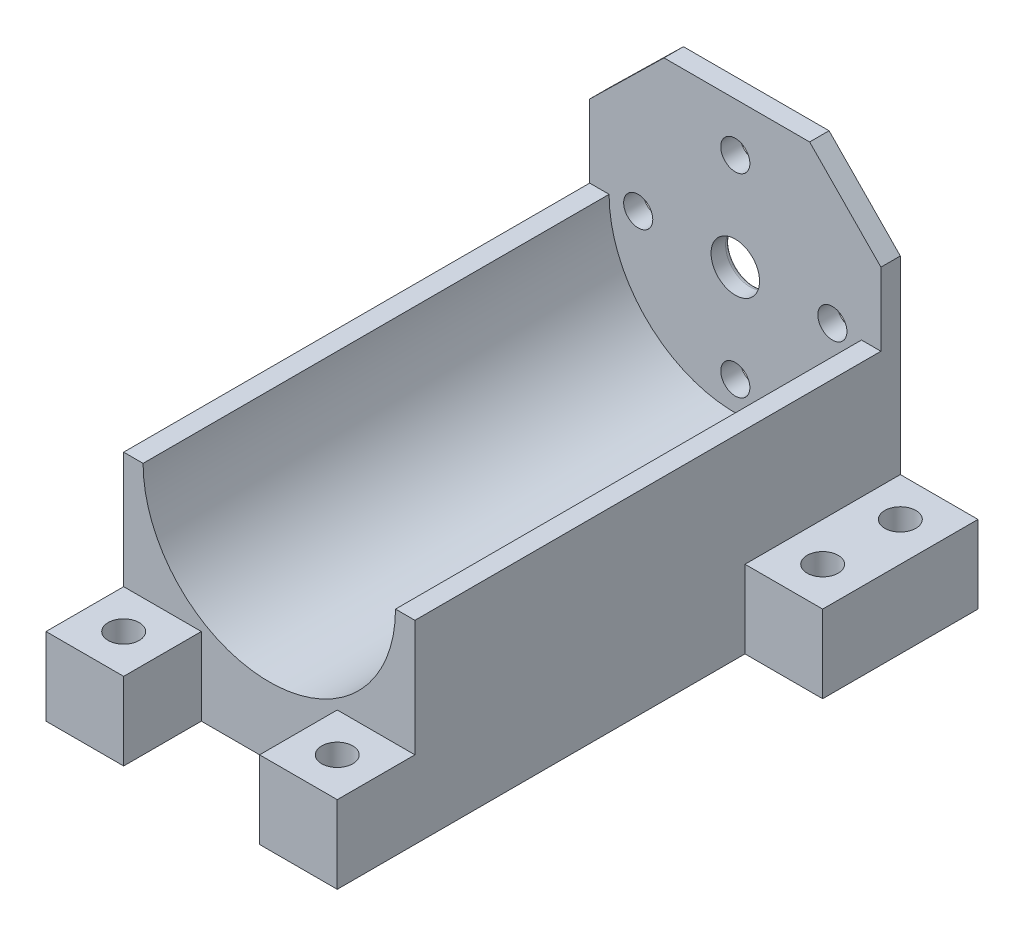
ISO-10303-21;
HEADER;
FILE_DESCRIPTION(('STEP AP214'),'2;1');
FILE_NAME('part.step','',(''),(''),'','','');
FILE_SCHEMA(('AUTOMOTIVE_DESIGN { 1 0 10303 214 1 1 1 1 }'));
ENDSEC;
DATA;
#1=APPLICATION_CONTEXT('core data for automotive mechanical design processes');
#2=APPLICATION_PROTOCOL_DEFINITION('international standard','automotive_design',2000,#1);
#3=PRODUCT_CONTEXT('',#1,'mechanical');
#4=PRODUCT('Part','Part','',(#3));
#5=PRODUCT_RELATED_PRODUCT_CATEGORY('part','',(#4));
#6=PRODUCT_DEFINITION_FORMATION('','',#4);
#7=PRODUCT_DEFINITION_CONTEXT('part definition',#1,'design');
#8=PRODUCT_DEFINITION('design','',#6,#7);
#9=PRODUCT_DEFINITION_SHAPE('','',#8);
#10=(LENGTH_UNIT() NAMED_UNIT(*) SI_UNIT(.MILLI.,.METRE.));
#11=(NAMED_UNIT(*) PLANE_ANGLE_UNIT() SI_UNIT($,.RADIAN.));
#12=(NAMED_UNIT(*) SI_UNIT($,.STERADIAN.) SOLID_ANGLE_UNIT());
#13=UNCERTAINTY_MEASURE_WITH_UNIT(LENGTH_MEASURE(1.E-05),#10,'distance_accuracy_value','');
#14=(GEOMETRIC_REPRESENTATION_CONTEXT(3) GLOBAL_UNCERTAINTY_ASSIGNED_CONTEXT((#13)) GLOBAL_UNIT_ASSIGNED_CONTEXT((#10,
#11,#12)) REPRESENTATION_CONTEXT('',''));
#15=CARTESIAN_POINT('',(0.,0.,0.));
#16=DIRECTION('',(0.,0.,1.));
#17=DIRECTION('',(1.,0.,0.));
#18=AXIS2_PLACEMENT_3D('',#15,#16,#17);
#19=CARTESIAN_POINT('',(0.,0.,50.));
#20=DIRECTION('',(0.,0.,-1.));
#21=DIRECTION('',(-1.,0.,0.));
#22=AXIS2_PLACEMENT_3D('',#19,#20,#21);
#23=PLANE('',#22);
#24=DIRECTION('',(0.,-1.,0.));
#25=VECTOR('',#24,1.);
#26=CARTESIAN_POINT('',(-7.,-12.,50.));
#27=LINE('',#26,#25);
#28=CARTESIAN_POINT('',(-7.,-12.,50.));
#29=VERTEX_POINT('',#28);
#30=CARTESIAN_POINT('',(-7.,-20.,50.));
#31=VERTEX_POINT('',#30);
#32=EDGE_CURVE('E192',#29,#31,#27,.T.);
#33=ORIENTED_EDGE('',*,*,#32,.T.);
#34=DIRECTION('',(-1.,0.,0.));
#35=VECTOR('',#34,1.);
#36=CARTESIAN_POINT('',(0.,-20.,50.));
#37=LINE('',#36,#35);
#38=CARTESIAN_POINT('',(7.,-20.,50.));
#39=VERTEX_POINT('',#38);
#40=EDGE_CURVE('E60',#39,#31,#37,.T.);
#41=ORIENTED_EDGE('',*,*,#40,.F.);
#42=DIRECTION('',(0.,-1.,0.));
#43=VECTOR('',#42,1.);
#44=CARTESIAN_POINT('',(7.,-12.,50.));
#45=LINE('',#44,#43);
#46=CARTESIAN_POINT('',(7.,-12.,50.));
#47=VERTEX_POINT('',#46);
#48=EDGE_CURVE('E236',#47,#39,#45,.T.);
#49=ORIENTED_EDGE('',*,*,#48,.F.);
#50=DIRECTION('',(-1.,0.,0.));
#51=VECTOR('',#50,1.);
#52=CARTESIAN_POINT('',(0.,-12.,50.));
#53=LINE('',#52,#51);
#54=CARTESIAN_POINT('',(15.,-12.,50.));
#55=VERTEX_POINT('',#54);
#56=EDGE_CURVE('E54',#55,#47,#53,.T.);
#57=ORIENTED_EDGE('',*,*,#56,.F.);
#58=DIRECTION('',(0.,1.,0.));
#59=VECTOR('',#58,1.);
#60=CARTESIAN_POINT('',(15.,0.,50.));
#61=LINE('',#60,#59);
#62=CARTESIAN_POINT('',(15.,0.,50.));
#63=VERTEX_POINT('',#62);
#64=EDGE_CURVE('E282',#55,#63,#61,.T.);
#65=ORIENTED_EDGE('',*,*,#64,.T.);
#66=DIRECTION('',(-1.,0.,0.));
#67=VECTOR('',#66,1.);
#68=CARTESIAN_POINT('',(0.,0.,50.));
#69=LINE('',#68,#67);
#70=CARTESIAN_POINT('',(13.,0.,50.));
#71=VERTEX_POINT('',#70);
#72=EDGE_CURVE('E280',#63,#71,#69,.T.);
#73=ORIENTED_EDGE('',*,*,#72,.T.);
#74=CARTESIAN_POINT('',(0.,0.,50.));
#75=DIRECTION('',(0.,0.,-1.));
#76=DIRECTION('',(-1.,0.,0.));
#77=AXIS2_PLACEMENT_3D('',#74,#75,#76);
#78=CIRCLE('',#77,13.);
#79=CARTESIAN_POINT('',(-13.,0.,50.));
#80=VERTEX_POINT('',#79);
#81=EDGE_CURVE('E277',#71,#80,#78,.T.);
#82=ORIENTED_EDGE('',*,*,#81,.T.);
#83=DIRECTION('',(-1.,0.,0.));
#84=VECTOR('',#83,1.);
#85=CARTESIAN_POINT('',(0.,0.,50.));
#86=LINE('',#85,#84);
#87=CARTESIAN_POINT('',(-15.,0.,50.));
#88=VERTEX_POINT('',#87);
#89=EDGE_CURVE('E287',#80,#88,#86,.T.);
#90=ORIENTED_EDGE('',*,*,#89,.T.);
#91=DIRECTION('',(0.,1.,0.));
#92=VECTOR('',#91,1.);
#93=CARTESIAN_POINT('',(-15.,0.,50.));
#94=LINE('',#93,#92);
#95=CARTESIAN_POINT('',(-15.,-12.,50.));
#96=VERTEX_POINT('',#95);
#97=EDGE_CURVE('E285',#96,#88,#94,.T.);
#98=ORIENTED_EDGE('',*,*,#97,.F.);
#99=DIRECTION('',(-1.,0.,0.));
#100=VECTOR('',#99,1.);
#101=CARTESIAN_POINT('',(0.,-12.,50.));
#102=LINE('',#101,#100);
#103=EDGE_CURVE('E189',#29,#96,#102,.T.);
#104=ORIENTED_EDGE('',*,*,#103,.F.);
#105=EDGE_LOOP('',(#33,#41,#49,#57,#65,#73,#82,#90,#98,#104));
#106=FACE_BOUND('',#105,.T.);
#107=ADVANCED_FACE('F39',(#106),#23,.F.);
#108=CARTESIAN_POINT('',(15.,0.,2.));
#109=DIRECTION('',(1.,0.,0.));
#110=DIRECTION('',(0.,0.,-1.));
#111=AXIS2_PLACEMENT_3D('',#108,#109,#110);
#112=PLANE('',#111);
#113=DIRECTION('',(0.,-1.,0.));
#114=VECTOR('',#113,1.);
#115=CARTESIAN_POINT('',(15.,-12.,16.));
#116=LINE('',#115,#114);
#117=CARTESIAN_POINT('',(15.,-12.,16.));
#118=VERTEX_POINT('',#117);
#119=CARTESIAN_POINT('',(15.,-20.,16.));
#120=VERTEX_POINT('',#119);
#121=EDGE_CURVE('E273',#118,#120,#116,.T.);
#122=ORIENTED_EDGE('',*,*,#121,.F.);
#123=DIRECTION('',(0.,0.,1.));
#124=VECTOR('',#123,1.);
#125=CARTESIAN_POINT('',(15.,-12.,0.));
#126=LINE('',#125,#124);
#127=CARTESIAN_POINT('',(15.,-12.,0.));
#128=VERTEX_POINT('',#127);
#129=EDGE_CURVE('E249',#128,#118,#126,.T.);
#130=ORIENTED_EDGE('',*,*,#129,.F.);
#131=DIRECTION('',(0.,-1.,0.));
#132=VECTOR('',#131,1.);
#133=CARTESIAN_POINT('',(15.,0.,0.));
#134=LINE('',#133,#132);
#135=CARTESIAN_POINT('',(15.,7.5,0.));
#136=VERTEX_POINT('',#135);
#137=EDGE_CURVE('E360',#136,#128,#134,.T.);
#138=ORIENTED_EDGE('',*,*,#137,.F.);
#139=DIRECTION('',(0.,0.,-1.));
#140=VECTOR('',#139,1.);
#141=CARTESIAN_POINT('',(15.,7.5,2.));
#142=LINE('',#141,#140);
#143=CARTESIAN_POINT('',(15.,7.5,2.));
#144=VERTEX_POINT('',#143);
#145=EDGE_CURVE('E379',#144,#136,#142,.T.);
#146=ORIENTED_EDGE('',*,*,#145,.F.);
#147=DIRECTION('',(0.,-1.,0.));
#148=VECTOR('',#147,1.);
#149=CARTESIAN_POINT('',(15.,0.,2.));
#150=LINE('',#149,#148);
#151=CARTESIAN_POINT('',(15.,0.,2.));
#152=VERTEX_POINT('',#151);
#153=EDGE_CURVE('E330',#144,#152,#150,.T.);
#154=ORIENTED_EDGE('',*,*,#153,.T.);
#155=DIRECTION('',(0.,0.,-1.));
#156=VECTOR('',#155,1.);
#157=CARTESIAN_POINT('',(15.,0.,50.));
#158=LINE('',#157,#156);
#159=EDGE_CURVE('E305',#63,#152,#158,.T.);
#160=ORIENTED_EDGE('',*,*,#159,.F.);
#161=ORIENTED_EDGE('',*,*,#64,.F.);
#162=DIRECTION('',(0.,0.,1.));
#163=VECTOR('',#162,1.);
#164=CARTESIAN_POINT('',(15.,-12.,0.));
#165=LINE('',#164,#163);
#166=CARTESIAN_POINT('',(15.,-12.,58.));
#167=VERTEX_POINT('',#166);
#168=EDGE_CURVE('E221',#55,#167,#165,.T.);
#169=ORIENTED_EDGE('',*,*,#168,.T.);
#170=DIRECTION('',(0.,-1.,0.));
#171=VECTOR('',#170,1.);
#172=CARTESIAN_POINT('',(15.,-12.,58.));
#173=LINE('',#172,#171);
#174=CARTESIAN_POINT('',(15.,-20.,58.));
#175=VERTEX_POINT('',#174);
#176=EDGE_CURVE('E232',#167,#175,#173,.T.);
#177=ORIENTED_EDGE('',*,*,#176,.T.);
#178=DIRECTION('',(0.,0.,-1.));
#179=VECTOR('',#178,1.);
#180=CARTESIAN_POINT('',(15.,-20.,50.));
#181=LINE('',#180,#179);
#182=EDGE_CURVE('E303',#175,#120,#181,.T.);
#183=ORIENTED_EDGE('',*,*,#182,.T.);
#184=EDGE_LOOP('',(#122,#130,#138,#146,#154,#160,#161,#169,#177,#183));
#185=FACE_BOUND('',#184,.T.);
#186=ADVANCED_FACE('F402',(#185),#112,.T.);
#187=CARTESIAN_POINT('',(11.4098237253435,11.1679362653464,2.));
#188=DIRECTION('',(0.714641377388513,0.699491030481627,0.));
#189=DIRECTION('',(-0.699491030481627,0.714641377388513,0.));
#190=AXIS2_PLACEMENT_3D('',#187,#188,#189);
#191=PLANE('',#190);
#192=DIRECTION('',(0.699491030481627,-0.714641377388513,0.));
#193=VECTOR('',#192,1.);
#194=CARTESIAN_POINT('',(11.4098237253435,11.1679362653464,0.));
#195=LINE('',#194,#193);
#196=CARTESIAN_POINT('',(7.65899947217843,15.,0.));
#197=VERTEX_POINT('',#196);
#198=EDGE_CURVE('E363',#197,#136,#195,.T.);
#199=ORIENTED_EDGE('',*,*,#198,.F.);
#200=DIRECTION('',(0.,0.,-1.));
#201=VECTOR('',#200,1.);
#202=CARTESIAN_POINT('',(7.65899947217843,15.,2.));
#203=LINE('',#202,#201);
#204=CARTESIAN_POINT('',(7.65899947217843,15.,2.));
#205=VERTEX_POINT('',#204);
#206=EDGE_CURVE('E377',#205,#197,#203,.T.);
#207=ORIENTED_EDGE('',*,*,#206,.F.);
#208=DIRECTION('',(0.699491030481627,-0.714641377388513,0.));
#209=VECTOR('',#208,1.);
#210=CARTESIAN_POINT('',(11.4098237253435,11.1679362653464,2.));
#211=LINE('',#210,#209);
#212=EDGE_CURVE('E333',#205,#144,#211,.T.);
#213=ORIENTED_EDGE('',*,*,#212,.T.);
#214=ORIENTED_EDGE('',*,*,#145,.T.);
#215=EDGE_LOOP('',(#199,#207,#213,#214));
#216=FACE_BOUND('',#215,.T.);
#217=ADVANCED_FACE('F407',(#216),#191,.T.);
#218=CARTESIAN_POINT('',(0.,15.,2.));
#219=DIRECTION('',(0.,1.,0.));
#220=DIRECTION('',(0.,0.,1.));
#221=AXIS2_PLACEMENT_3D('',#218,#219,#220);
#222=PLANE('',#221);
#223=DIRECTION('',(1.,0.,0.));
#224=VECTOR('',#223,1.);
#225=CARTESIAN_POINT('',(0.,15.,0.));
#226=LINE('',#225,#224);
#227=CARTESIAN_POINT('',(-7.34100052782156,15.,0.));
#228=VERTEX_POINT('',#227);
#229=EDGE_CURVE('E366',#228,#197,#226,.T.);
#230=ORIENTED_EDGE('',*,*,#229,.F.);
#231=DIRECTION('',(0.,0.,-1.));
#232=VECTOR('',#231,1.);
#233=CARTESIAN_POINT('',(-7.34100052782156,15.,2.));
#234=LINE('',#233,#232);
#235=CARTESIAN_POINT('',(-7.34100052782156,15.,2.));
#236=VERTEX_POINT('',#235);
#237=EDGE_CURVE('E375',#236,#228,#234,.T.);
#238=ORIENTED_EDGE('',*,*,#237,.F.);
#239=DIRECTION('',(1.,0.,0.));
#240=VECTOR('',#239,1.);
#241=CARTESIAN_POINT('',(0.,15.,2.));
#242=LINE('',#241,#240);
#243=EDGE_CURVE('E336',#236,#205,#242,.T.);
#244=ORIENTED_EDGE('',*,*,#243,.T.);
#245=ORIENTED_EDGE('',*,*,#206,.T.);
#246=EDGE_LOOP('',(#230,#238,#244,#245));
#247=FACE_BOUND('',#246,.T.);
#248=ADVANCED_FACE('F439',(#247),#222,.T.);
#249=CARTESIAN_POINT('',(-11.0918605271674,11.3270071897403,2.));
#250=DIRECTION('',(-0.699651605960082,0.714484170767609,0.));
#251=DIRECTION('',(-0.714484170767609,-0.699651605960082,0.));
#252=AXIS2_PLACEMENT_3D('',#249,#250,#251);
#253=PLANE('',#252);
#254=DIRECTION('',(0.714484170767609,0.699651605960082,0.));
#255=VECTOR('',#254,1.);
#256=CARTESIAN_POINT('',(-11.0918605271674,11.3270071897403,0.));
#257=LINE('',#256,#255);
#258=CARTESIAN_POINT('',(-15.,7.5,0.));
#259=VERTEX_POINT('',#258);
#260=EDGE_CURVE('E369',#259,#228,#257,.T.);
#261=ORIENTED_EDGE('',*,*,#260,.F.);
#262=DIRECTION('',(0.,0.,-1.));
#263=VECTOR('',#262,1.);
#264=CARTESIAN_POINT('',(-15.,7.5,2.));
#265=LINE('',#264,#263);
#266=CARTESIAN_POINT('',(-15.,7.5,2.));
#267=VERTEX_POINT('',#266);
#268=EDGE_CURVE('E348',#267,#259,#265,.T.);
#269=ORIENTED_EDGE('',*,*,#268,.F.);
#270=DIRECTION('',(0.714484170767609,0.699651605960082,0.));
#271=VECTOR('',#270,1.);
#272=CARTESIAN_POINT('',(-11.0918605271674,11.3270071897403,2.));
#273=LINE('',#272,#271);
#274=EDGE_CURVE('E339',#267,#236,#273,.T.);
#275=ORIENTED_EDGE('',*,*,#274,.T.);
#276=ORIENTED_EDGE('',*,*,#237,.T.);
#277=EDGE_LOOP('',(#261,#269,#275,#276));
#278=FACE_BOUND('',#277,.T.);
#279=ADVANCED_FACE('F435',(#278),#253,.T.);
#280=CARTESIAN_POINT('',(-15.,0.,2.));
#281=DIRECTION('',(-1.,0.,0.));
#282=DIRECTION('',(0.,0.,1.));
#283=AXIS2_PLACEMENT_3D('',#280,#281,#282);
#284=PLANE('',#283);
#285=DIRECTION('',(0.,1.,0.));
#286=VECTOR('',#285,1.);
#287=CARTESIAN_POINT('',(-15.,0.,0.));
#288=LINE('',#287,#286);
#289=CARTESIAN_POINT('',(-15.,-20.,0.));
#290=VERTEX_POINT('',#289);
#291=EDGE_CURVE('E313',#290,#259,#288,.T.);
#292=ORIENTED_EDGE('',*,*,#291,.F.);
#293=DIRECTION('',(0.,0.,-1.));
#294=VECTOR('',#293,1.);
#295=CARTESIAN_POINT('',(-15.,-20.,50.));
#296=LINE('',#295,#294);
#297=CARTESIAN_POINT('',(-15.,-20.,58.));
#298=VERTEX_POINT('',#297);
#299=EDGE_CURVE('E300',#298,#290,#296,.T.);
#300=ORIENTED_EDGE('',*,*,#299,.F.);
#301=DIRECTION('',(0.,-1.,0.));
#302=VECTOR('',#301,1.);
#303=CARTESIAN_POINT('',(-15.,-12.,58.));
#304=LINE('',#303,#302);
#305=CARTESIAN_POINT('',(-15.,-12.,58.));
#306=VERTEX_POINT('',#305);
#307=EDGE_CURVE('E188',#306,#298,#304,.T.);
#308=ORIENTED_EDGE('',*,*,#307,.F.);
#309=DIRECTION('',(0.,0.,1.));
#310=VECTOR('',#309,1.);
#311=CARTESIAN_POINT('',(-15.,-12.,0.));
#312=LINE('',#311,#310);
#313=EDGE_CURVE('E176',#96,#306,#312,.T.);
#314=ORIENTED_EDGE('',*,*,#313,.F.);
#315=ORIENTED_EDGE('',*,*,#97,.T.);
#316=DIRECTION('',(0.,0.,-1.));
#317=VECTOR('',#316,1.);
#318=CARTESIAN_POINT('',(-15.,0.,50.));
#319=LINE('',#318,#317);
#320=CARTESIAN_POINT('',(-15.,0.,2.));
#321=VERTEX_POINT('',#320);
#322=EDGE_CURVE('E297',#88,#321,#319,.T.);
#323=ORIENTED_EDGE('',*,*,#322,.T.);
#324=DIRECTION('',(0.,1.,0.));
#325=VECTOR('',#324,1.);
#326=CARTESIAN_POINT('',(-15.,0.,2.));
#327=LINE('',#326,#325);
#328=EDGE_CURVE('E342',#321,#267,#327,.T.);
#329=ORIENTED_EDGE('',*,*,#328,.T.);
#330=ORIENTED_EDGE('',*,*,#268,.T.);
#331=EDGE_LOOP('',(#292,#300,#308,#314,#315,#323,#329,#330));
#332=FACE_BOUND('',#331,.T.);
#333=ADVANCED_FACE('F431',(#332),#284,.T.);
#334=CARTESIAN_POINT('',(0.,10.,2.));
#335=DIRECTION('',(0.,0.,-1.));
#336=DIRECTION('',(-1.,0.,0.));
#337=AXIS2_PLACEMENT_3D('',#334,#335,#336);
#338=CYLINDRICAL_SURFACE('',#337,1.5);
#339=CARTESIAN_POINT('',(0.,10.,2.));
#340=DIRECTION('',(0.,0.,1.));
#341=DIRECTION('',(1.,0.,0.));
#342=AXIS2_PLACEMENT_3D('',#339,#340,#341);
#343=CIRCLE('',#342,1.5);
#344=CARTESIAN_POINT('',(1.5,10.,2.));
#345=VERTEX_POINT('',#344);
#346=EDGE_CURVE('E322',#345,#345,#343,.T.);
#347=ORIENTED_EDGE('',*,*,#346,.T.);
#348=EDGE_LOOP('',(#347));
#349=FACE_BOUND('',#348,.T.);
#350=CARTESIAN_POINT('',(0.,10.,0.));
#351=DIRECTION('',(0.,0.,1.));
#352=DIRECTION('',(1.,0.,0.));
#353=AXIS2_PLACEMENT_3D('',#350,#351,#352);
#354=CIRCLE('',#353,1.5);
#355=CARTESIAN_POINT('',(1.5,10.,0.));
#356=VERTEX_POINT('',#355);
#357=EDGE_CURVE('E357',#356,#356,#354,.T.);
#358=ORIENTED_EDGE('',*,*,#357,.F.);
#359=EDGE_LOOP('',(#358));
#360=FACE_BOUND('',#359,.T.);
#361=ADVANCED_FACE('F434',(#349,#360),#338,.F.);
#362=CARTESIAN_POINT('',(-10.,0.,2.));
#363=DIRECTION('',(0.,0.,-1.));
#364=DIRECTION('',(-1.,0.,0.));
#365=AXIS2_PLACEMENT_3D('',#362,#363,#364);
#366=CYLINDRICAL_SURFACE('',#365,1.5);
#367=CARTESIAN_POINT('',(-10.,0.,2.));
#368=DIRECTION('',(0.,0.,1.));
#369=DIRECTION('',(1.,0.,0.));
#370=AXIS2_PLACEMENT_3D('',#367,#368,#369);
#371=CIRCLE('',#370,1.5);
#372=CARTESIAN_POINT('',(-8.5,0.,2.));
#373=VERTEX_POINT('',#372);
#374=EDGE_CURVE('E319',#373,#373,#371,.T.);
#375=ORIENTED_EDGE('',*,*,#374,.T.);
#376=EDGE_LOOP('',(#375));
#377=FACE_BOUND('',#376,.T.);
#378=CARTESIAN_POINT('',(-10.,0.,0.));
#379=DIRECTION('',(0.,0.,1.));
#380=DIRECTION('',(1.,0.,0.));
#381=AXIS2_PLACEMENT_3D('',#378,#379,#380);
#382=CIRCLE('',#381,1.5);
#383=CARTESIAN_POINT('',(-8.5,0.,0.));
#384=VERTEX_POINT('',#383);
#385=EDGE_CURVE('E354',#384,#384,#382,.T.);
#386=ORIENTED_EDGE('',*,*,#385,.F.);
#387=EDGE_LOOP('',(#386));
#388=FACE_BOUND('',#387,.T.);
#389=ADVANCED_FACE('F449',(#377,#388),#366,.F.);
#390=CARTESIAN_POINT('',(10.,0.,2.));
#391=DIRECTION('',(0.,0.,-1.));
#392=DIRECTION('',(-1.,0.,0.));
#393=AXIS2_PLACEMENT_3D('',#390,#391,#392);
#394=CYLINDRICAL_SURFACE('',#393,1.5);
#395=CARTESIAN_POINT('',(10.,0.,2.));
#396=DIRECTION('',(0.,0.,1.));
#397=DIRECTION('',(1.,0.,0.));
#398=AXIS2_PLACEMENT_3D('',#395,#396,#397);
#399=CIRCLE('',#398,1.5);
#400=CARTESIAN_POINT('',(11.5,0.,2.));
#401=VERTEX_POINT('',#400);
#402=EDGE_CURVE('E316',#401,#401,#399,.T.);
#403=ORIENTED_EDGE('',*,*,#402,.T.);
#404=EDGE_LOOP('',(#403));
#405=FACE_BOUND('',#404,.T.);
#406=CARTESIAN_POINT('',(10.,0.,0.));
#407=DIRECTION('',(0.,0.,1.));
#408=DIRECTION('',(1.,0.,0.));
#409=AXIS2_PLACEMENT_3D('',#406,#407,#408);
#410=CIRCLE('',#409,1.5);
#411=CARTESIAN_POINT('',(11.5,0.,0.));
#412=VERTEX_POINT('',#411);
#413=EDGE_CURVE('E351',#412,#412,#410,.T.);
#414=ORIENTED_EDGE('',*,*,#413,.F.);
#415=EDGE_LOOP('',(#414));
#416=FACE_BOUND('',#415,.T.);
#417=ADVANCED_FACE('F453',(#405,#416),#394,.F.);
#418=CARTESIAN_POINT('',(0.,-10.,2.));
#419=DIRECTION('',(0.,0.,-1.));
#420=DIRECTION('',(-1.,0.,0.));
#421=AXIS2_PLACEMENT_3D('',#418,#419,#420);
#422=CYLINDRICAL_SURFACE('',#421,1.5);
#423=CARTESIAN_POINT('',(0.,-10.,2.));
#424=DIRECTION('',(0.,0.,1.));
#425=DIRECTION('',(1.,0.,0.));
#426=AXIS2_PLACEMENT_3D('',#423,#424,#425);
#427=CIRCLE('',#426,1.5);
#428=CARTESIAN_POINT('',(1.5,-10.,2.));
#429=VERTEX_POINT('',#428);
#430=EDGE_CURVE('E312',#429,#429,#427,.T.);
#431=ORIENTED_EDGE('',*,*,#430,.T.);
#432=EDGE_LOOP('',(#431));
#433=FACE_BOUND('',#432,.T.);
#434=CARTESIAN_POINT('',(0.,-10.,0.));
#435=DIRECTION('',(0.,0.,1.));
#436=DIRECTION('',(1.,0.,0.));
#437=AXIS2_PLACEMENT_3D('',#434,#435,#436);
#438=CIRCLE('',#437,1.5);
#439=CARTESIAN_POINT('',(1.5,-10.,0.));
#440=VERTEX_POINT('',#439);
#441=EDGE_CURVE('E296',#440,#440,#438,.T.);
#442=ORIENTED_EDGE('',*,*,#441,.F.);
#443=EDGE_LOOP('',(#442));
#444=FACE_BOUND('',#443,.T.);
#445=ADVANCED_FACE('F457',(#433,#444),#422,.F.);
#446=CARTESIAN_POINT('',(0.,0.,2.));
#447=DIRECTION('',(0.,0.,-1.));
#448=DIRECTION('',(-1.,0.,0.));
#449=AXIS2_PLACEMENT_3D('',#446,#447,#448);
#450=CYLINDRICAL_SURFACE('',#449,2.5);
#451=CARTESIAN_POINT('',(0.,0.,0.5));
#452=DIRECTION('',(0.,0.,1.));
#453=DIRECTION('',(1.,0.,0.));
#454=AXIS2_PLACEMENT_3D('',#451,#452,#453);
#455=CIRCLE('',#454,2.5);
#456=CARTESIAN_POINT('',(2.5,0.,0.5));
#457=VERTEX_POINT('',#456);
#458=EDGE_CURVE('E11',#457,#457,#455,.F.);
#459=ORIENTED_EDGE('',*,*,#458,.T.);
#460=EDGE_LOOP('',(#459));
#461=FACE_BOUND('',#460,.T.);
#462=CARTESIAN_POINT('',(0.,0.,2.));
#463=DIRECTION('',(0.,0.,1.));
#464=DIRECTION('',(1.,0.,0.));
#465=AXIS2_PLACEMENT_3D('',#462,#463,#464);
#466=CIRCLE('',#465,2.5);
#467=CARTESIAN_POINT('',(2.5,0.,2.));
#468=VERTEX_POINT('',#467);
#469=EDGE_CURVE('E309',#468,#468,#466,.T.);
#470=ORIENTED_EDGE('',*,*,#469,.T.);
#471=EDGE_LOOP('',(#470));
#472=FACE_BOUND('',#471,.T.);
#473=ADVANCED_FACE('F427',(#461,#472),#450,.F.);
#474=CARTESIAN_POINT('',(0.,0.,2.));
#475=DIRECTION('',(0.,0.,1.));
#476=DIRECTION('',(1.,0.,0.));
#477=AXIS2_PLACEMENT_3D('',#474,#475,#476);
#478=PLANE('',#477);
#479=ORIENTED_EDGE('',*,*,#469,.F.);
#480=EDGE_LOOP('',(#479));
#481=FACE_BOUND('',#480,.T.);
#482=ORIENTED_EDGE('',*,*,#430,.F.);
#483=EDGE_LOOP('',(#482));
#484=FACE_BOUND('',#483,.T.);
#485=ORIENTED_EDGE('',*,*,#402,.F.);
#486=EDGE_LOOP('',(#485));
#487=FACE_BOUND('',#486,.T.);
#488=ORIENTED_EDGE('',*,*,#374,.F.);
#489=EDGE_LOOP('',(#488));
#490=FACE_BOUND('',#489,.T.);
#491=ORIENTED_EDGE('',*,*,#346,.F.);
#492=EDGE_LOOP('',(#491));
#493=FACE_BOUND('',#492,.T.);
#494=CARTESIAN_POINT('',(0.,0.,2.));
#495=DIRECTION('',(0.,0.,1.));
#496=DIRECTION('',(1.,0.,0.));
#497=AXIS2_PLACEMENT_3D('',#494,#495,#496);
#498=CIRCLE('',#497,13.);
#499=CARTESIAN_POINT('',(-13.,0.,2.));
#500=VERTEX_POINT('',#499);
#501=CARTESIAN_POINT('',(13.,0.,2.));
#502=VERTEX_POINT('',#501);
#503=EDGE_CURVE('E325',#500,#502,#498,.T.);
#504=ORIENTED_EDGE('',*,*,#503,.T.);
#505=DIRECTION('',(-1.,0.,0.));
#506=VECTOR('',#505,1.);
#507=CARTESIAN_POINT('',(0.,0.,2.));
#508=LINE('',#507,#506);
#509=EDGE_CURVE('E328',#152,#502,#508,.T.);
#510=ORIENTED_EDGE('',*,*,#509,.F.);
#511=ORIENTED_EDGE('',*,*,#153,.F.);
#512=ORIENTED_EDGE('',*,*,#212,.F.);
#513=ORIENTED_EDGE('',*,*,#243,.F.);
#514=ORIENTED_EDGE('',*,*,#274,.F.);
#515=ORIENTED_EDGE('',*,*,#328,.F.);
#516=DIRECTION('',(1.,0.,0.));
#517=VECTOR('',#516,1.);
#518=CARTESIAN_POINT('',(0.,0.,2.));
#519=LINE('',#518,#517);
#520=EDGE_CURVE('E345',#321,#500,#519,.T.);
#521=ORIENTED_EDGE('',*,*,#520,.T.);
#522=EDGE_LOOP('',(#504,#510,#511,#512,#513,#514,#515,#521));
#523=FACE_BOUND('',#522,.T.);
#524=ADVANCED_FACE('F424',(#481,#484,#487,#490,#493,#523),#478,.T.);
#525=CARTESIAN_POINT('',(0.,0.,0.));
#526=DIRECTION('',(0.,0.,1.));
#527=DIRECTION('',(1.,0.,0.));
#528=AXIS2_PLACEMENT_3D('',#525,#526,#527);
#529=PLANE('',#528);
#530=CARTESIAN_POINT('',(0.,0.,0.));
#531=DIRECTION('',(0.,0.,1.));
#532=DIRECTION('',(1.,0.,0.));
#533=AXIS2_PLACEMENT_3D('',#530,#531,#532);
#534=CIRCLE('',#533,3.);
#535=CARTESIAN_POINT('',(3.,0.,0.));
#536=VERTEX_POINT('',#535);
#537=EDGE_CURVE('E47',#536,#536,#534,.T.);
#538=ORIENTED_EDGE('',*,*,#537,.T.);
#539=EDGE_LOOP('',(#538));
#540=FACE_BOUND('',#539,.T.);
#541=ORIENTED_EDGE('',*,*,#441,.T.);
#542=EDGE_LOOP('',(#541));
#543=FACE_BOUND('',#542,.T.);
#544=ORIENTED_EDGE('',*,*,#413,.T.);
#545=EDGE_LOOP('',(#544));
#546=FACE_BOUND('',#545,.T.);
#547=ORIENTED_EDGE('',*,*,#385,.T.);
#548=EDGE_LOOP('',(#547));
#549=FACE_BOUND('',#548,.T.);
#550=ORIENTED_EDGE('',*,*,#357,.T.);
#551=EDGE_LOOP('',(#550));
#552=FACE_BOUND('',#551,.T.);
#553=DIRECTION('',(-1.,0.,0.));
#554=VECTOR('',#553,1.);
#555=CARTESIAN_POINT('',(0.,-20.,0.));
#556=LINE('',#555,#554);
#557=CARTESIAN_POINT('',(23.,-20.,0.));
#558=VERTEX_POINT('',#557);
#559=EDGE_CURVE('E272',#558,#290,#556,.T.);
#560=ORIENTED_EDGE('',*,*,#559,.T.);
#561=ORIENTED_EDGE('',*,*,#291,.T.);
#562=ORIENTED_EDGE('',*,*,#260,.T.);
#563=ORIENTED_EDGE('',*,*,#229,.T.);
#564=ORIENTED_EDGE('',*,*,#198,.T.);
#565=ORIENTED_EDGE('',*,*,#137,.T.);
#566=DIRECTION('',(1.,0.,0.));
#567=VECTOR('',#566,1.);
#568=CARTESIAN_POINT('',(0.,-12.,0.));
#569=LINE('',#568,#567);
#570=CARTESIAN_POINT('',(23.,-12.,0.));
#571=VERTEX_POINT('',#570);
#572=EDGE_CURVE('E252',#128,#571,#569,.T.);
#573=ORIENTED_EDGE('',*,*,#572,.T.);
#574=DIRECTION('',(0.,-1.,0.));
#575=VECTOR('',#574,1.);
#576=CARTESIAN_POINT('',(23.,-12.,0.));
#577=LINE('',#576,#575);
#578=EDGE_CURVE('E269',#571,#558,#577,.T.);
#579=ORIENTED_EDGE('',*,*,#578,.T.);
#580=EDGE_LOOP('',(#560,#561,#562,#563,#564,#565,#573,#579));
#581=FACE_BOUND('',#580,.T.);
#582=ADVANCED_FACE('F383',(#540,#543,#546,#549,#552,#581),#529,.F.);
#583=CARTESIAN_POINT('',(0.,0.,50.));
#584=DIRECTION('',(0.,0.,-1.));
#585=DIRECTION('',(-1.,0.,0.));
#586=AXIS2_PLACEMENT_3D('',#583,#584,#585);
#587=CYLINDRICAL_SURFACE('',#586,13.);
#588=ORIENTED_EDGE('',*,*,#503,.F.);
#589=DIRECTION('',(0.,0.,-1.));
#590=VECTOR('',#589,1.);
#591=CARTESIAN_POINT('',(-13.,0.,50.));
#592=LINE('',#591,#590);
#593=EDGE_CURVE('E293',#80,#500,#592,.T.);
#594=ORIENTED_EDGE('',*,*,#593,.F.);
#595=ORIENTED_EDGE('',*,*,#81,.F.);
#596=DIRECTION('',(0.,0.,-1.));
#597=VECTOR('',#596,1.);
#598=CARTESIAN_POINT('',(13.,0.,50.));
#599=LINE('',#598,#597);
#600=EDGE_CURVE('E290',#71,#502,#599,.T.);
#601=ORIENTED_EDGE('',*,*,#600,.T.);
#602=EDGE_LOOP('',(#588,#594,#595,#601));
#603=FACE_BOUND('',#602,.T.);
#604=ADVANCED_FACE('F416',(#603),#587,.F.);
#605=CARTESIAN_POINT('',(0.,0.,50.));
#606=DIRECTION('',(0.,-1.,0.));
#607=DIRECTION('',(0.,0.,-1.));
#608=AXIS2_PLACEMENT_3D('',#605,#606,#607);
#609=PLANE('',#608);
#610=ORIENTED_EDGE('',*,*,#520,.F.);
#611=ORIENTED_EDGE('',*,*,#322,.F.);
#612=ORIENTED_EDGE('',*,*,#89,.F.);
#613=ORIENTED_EDGE('',*,*,#593,.T.);
#614=EDGE_LOOP('',(#610,#611,#612,#613));
#615=FACE_BOUND('',#614,.T.);
#616=ADVANCED_FACE('F413',(#615),#609,.F.);
#617=CARTESIAN_POINT('',(0.,-20.,50.));
#618=DIRECTION('',(0.,-1.,0.));
#619=DIRECTION('',(0.,0.,-1.));
#620=AXIS2_PLACEMENT_3D('',#617,#618,#619);
#621=PLANE('',#620);
#622=ORIENTED_EDGE('',*,*,#559,.F.);
#623=DIRECTION('',(0.,0.,1.));
#624=VECTOR('',#623,1.);
#625=CARTESIAN_POINT('',(23.,-20.,0.));
#626=LINE('',#625,#624);
#627=CARTESIAN_POINT('',(23.,-20.,16.));
#628=VERTEX_POINT('',#627);
#629=EDGE_CURVE('E261',#558,#628,#626,.T.);
#630=ORIENTED_EDGE('',*,*,#629,.T.);
#631=DIRECTION('',(-1.,0.,0.));
#632=VECTOR('',#631,1.);
#633=CARTESIAN_POINT('',(0.,-20.,16.));
#634=LINE('',#633,#632);
#635=EDGE_CURVE('E264',#628,#120,#634,.T.);
#636=ORIENTED_EDGE('',*,*,#635,.T.);
#637=ORIENTED_EDGE('',*,*,#182,.F.);
#638=DIRECTION('',(-1.,0.,0.));
#639=VECTOR('',#638,1.);
#640=CARTESIAN_POINT('',(0.,-20.,58.));
#641=LINE('',#640,#639);
#642=CARTESIAN_POINT('',(7.,-20.,58.));
#643=VERTEX_POINT('',#642);
#644=EDGE_CURVE('E227',#175,#643,#641,.T.);
#645=ORIENTED_EDGE('',*,*,#644,.T.);
#646=DIRECTION('',(0.,0.,-1.));
#647=VECTOR('',#646,1.);
#648=CARTESIAN_POINT('',(7.,-20.,0.));
#649=LINE('',#648,#647);
#650=EDGE_CURVE('E214',#643,#39,#649,.T.);
#651=ORIENTED_EDGE('',*,*,#650,.T.);
#652=ORIENTED_EDGE('',*,*,#40,.T.);
#653=DIRECTION('',(0.,0.,-1.));
#654=VECTOR('',#653,1.);
#655=CARTESIAN_POINT('',(-7.,-20.,0.));
#656=LINE('',#655,#654);
#657=CARTESIAN_POINT('',(-7.,-20.,58.));
#658=VERTEX_POINT('',#657);
#659=EDGE_CURVE('E204',#658,#31,#656,.T.);
#660=ORIENTED_EDGE('',*,*,#659,.F.);
#661=DIRECTION('',(1.,0.,0.));
#662=VECTOR('',#661,1.);
#663=CARTESIAN_POINT('',(0.,-20.,58.));
#664=LINE('',#663,#662);
#665=EDGE_CURVE('E185',#298,#658,#664,.T.);
#666=ORIENTED_EDGE('',*,*,#665,.F.);
#667=ORIENTED_EDGE('',*,*,#299,.T.);
#668=EDGE_LOOP('',(#622,#630,#636,#637,#645,#651,#652,#660,#666,#667));
#669=FACE_BOUND('',#668,.T.);
#670=CARTESIAN_POINT('',(19.,-20.,12.));
#671=DIRECTION('',(0.,-1.,0.));
#672=DIRECTION('',(0.,0.,-1.));
#673=AXIS2_PLACEMENT_3D('',#670,#671,#672);
#674=CIRCLE('',#673,1.6);
#675=CARTESIAN_POINT('',(19.,-20.,10.4));
#676=VERTEX_POINT('',#675);
#677=EDGE_CURVE('E235',#676,#676,#674,.T.);
#678=ORIENTED_EDGE('',*,*,#677,.F.);
#679=EDGE_LOOP('',(#678));
#680=FACE_BOUND('',#679,.T.);
#681=CARTESIAN_POINT('',(19.,-20.,4.));
#682=DIRECTION('',(0.,-1.,0.));
#683=DIRECTION('',(0.,0.,-1.));
#684=AXIS2_PLACEMENT_3D('',#681,#682,#683);
#685=CIRCLE('',#684,1.6);
#686=CARTESIAN_POINT('',(19.,-20.,2.4));
#687=VERTEX_POINT('',#686);
#688=EDGE_CURVE('E243',#687,#687,#685,.T.);
#689=ORIENTED_EDGE('',*,*,#688,.F.);
#690=EDGE_LOOP('',(#689));
#691=FACE_BOUND('',#690,.T.);
#692=CARTESIAN_POINT('',(11.,-20.,54.));
#693=DIRECTION('',(0.,-1.,0.));
#694=DIRECTION('',(0.,0.,-1.));
#695=AXIS2_PLACEMENT_3D('',#692,#693,#694);
#696=CIRCLE('',#695,1.6);
#697=CARTESIAN_POINT('',(11.,-20.,52.4));
#698=VERTEX_POINT('',#697);
#699=EDGE_CURVE('E208',#698,#698,#696,.T.);
#700=ORIENTED_EDGE('',*,*,#699,.F.);
#701=EDGE_LOOP('',(#700));
#702=FACE_BOUND('',#701,.T.);
#703=CARTESIAN_POINT('',(-11.,-20.,54.));
#704=DIRECTION('',(0.,-1.,0.));
#705=DIRECTION('',(0.,0.,-1.));
#706=AXIS2_PLACEMENT_3D('',#703,#704,#705);
#707=CIRCLE('',#706,1.6);
#708=CARTESIAN_POINT('',(-11.,-20.,52.4));
#709=VERTEX_POINT('',#708);
#710=EDGE_CURVE('E201',#709,#709,#707,.T.);
#711=ORIENTED_EDGE('',*,*,#710,.F.);
#712=EDGE_LOOP('',(#711));
#713=FACE_BOUND('',#712,.T.);
#714=ADVANCED_FACE('F397',(#669,#680,#691,#702,#713),#621,.T.);
#715=CARTESIAN_POINT('',(0.,0.,50.));
#716=DIRECTION('',(0.,-1.,0.));
#717=DIRECTION('',(0.,0.,-1.));
#718=AXIS2_PLACEMENT_3D('',#715,#716,#717);
#719=PLANE('',#718);
#720=ORIENTED_EDGE('',*,*,#509,.T.);
#721=ORIENTED_EDGE('',*,*,#600,.F.);
#722=ORIENTED_EDGE('',*,*,#72,.F.);
#723=ORIENTED_EDGE('',*,*,#159,.T.);
#724=EDGE_LOOP('',(#720,#721,#722,#723));
#725=FACE_BOUND('',#724,.T.);
#726=ADVANCED_FACE('F388',(#725),#719,.F.);
#727=CARTESIAN_POINT('',(0.,0.,0.5));
#728=DIRECTION('',(0.,0.,1.));
#729=DIRECTION('',(1.,0.,0.));
#730=AXIS2_PLACEMENT_3D('',#727,#728,#729);
#731=TOROIDAL_SURFACE('',#730,3.,0.5);
#732=ORIENTED_EDGE('',*,*,#458,.F.);
#733=EDGE_LOOP('',(#732));
#734=FACE_BOUND('',#733,.T.);
#735=ORIENTED_EDGE('',*,*,#537,.F.);
#736=EDGE_LOOP('',(#735));
#737=FACE_BOUND('',#736,.T.);
#738=ADVANCED_FACE('F41',(#734,#737),#731,.T.);
#739=CARTESIAN_POINT('',(23.,-12.,0.));
#740=DIRECTION('',(1.,0.,0.));
#741=DIRECTION('',(0.,0.,-1.));
#742=AXIS2_PLACEMENT_3D('',#739,#740,#741);
#743=PLANE('',#742);
#744=ORIENTED_EDGE('',*,*,#629,.F.);
#745=ORIENTED_EDGE('',*,*,#578,.F.);
#746=DIRECTION('',(0.,0.,1.));
#747=VECTOR('',#746,1.);
#748=CARTESIAN_POINT('',(23.,-12.,0.));
#749=LINE('',#748,#747);
#750=CARTESIAN_POINT('',(23.,-12.,16.));
#751=VERTEX_POINT('',#750);
#752=EDGE_CURVE('E242',#571,#751,#749,.T.);
#753=ORIENTED_EDGE('',*,*,#752,.T.);
#754=DIRECTION('',(0.,-1.,0.));
#755=VECTOR('',#754,1.);
#756=CARTESIAN_POINT('',(23.,-12.,16.));
#757=LINE('',#756,#755);
#758=EDGE_CURVE('E258',#751,#628,#757,.T.);
#759=ORIENTED_EDGE('',*,*,#758,.T.);
#760=EDGE_LOOP('',(#744,#745,#753,#759));
#761=FACE_BOUND('',#760,.T.);
#762=ADVANCED_FACE('F387',(#761),#743,.T.);
#763=CARTESIAN_POINT('',(0.,-12.,16.));
#764=DIRECTION('',(0.,0.,1.));
#765=DIRECTION('',(1.,0.,0.));
#766=AXIS2_PLACEMENT_3D('',#763,#764,#765);
#767=PLANE('',#766);
#768=ORIENTED_EDGE('',*,*,#635,.F.);
#769=ORIENTED_EDGE('',*,*,#758,.F.);
#770=DIRECTION('',(-1.,0.,0.));
#771=VECTOR('',#770,1.);
#772=CARTESIAN_POINT('',(0.,-12.,16.));
#773=LINE('',#772,#771);
#774=EDGE_CURVE('E246',#751,#118,#773,.T.);
#775=ORIENTED_EDGE('',*,*,#774,.T.);
#776=ORIENTED_EDGE('',*,*,#121,.T.);
#777=EDGE_LOOP('',(#768,#769,#775,#776));
#778=FACE_BOUND('',#777,.T.);
#779=ADVANCED_FACE('F394',(#778),#767,.T.);
#780=CARTESIAN_POINT('',(19.,-12.,12.));
#781=DIRECTION('',(0.,-1.,0.));
#782=DIRECTION('',(0.,0.,-1.));
#783=AXIS2_PLACEMENT_3D('',#780,#781,#782);
#784=CYLINDRICAL_SURFACE('',#783,1.6);
#785=CARTESIAN_POINT('',(19.,-12.,12.));
#786=DIRECTION('',(0.,-1.,0.));
#787=DIRECTION('',(0.,0.,-1.));
#788=AXIS2_PLACEMENT_3D('',#785,#786,#787);
#789=CIRCLE('',#788,1.6);
#790=CARTESIAN_POINT('',(19.,-12.,10.4));
#791=VERTEX_POINT('',#790);
#792=EDGE_CURVE('E239',#791,#791,#789,.T.);
#793=ORIENTED_EDGE('',*,*,#792,.F.);
#794=EDGE_LOOP('',(#793));
#795=FACE_BOUND('',#794,.T.);
#796=ORIENTED_EDGE('',*,*,#677,.T.);
#797=EDGE_LOOP('',(#796));
#798=FACE_BOUND('',#797,.T.);
#799=ADVANCED_FACE('F412',(#795,#798),#784,.F.);
#800=CARTESIAN_POINT('',(19.,-12.,4.));
#801=DIRECTION('',(0.,-1.,0.));
#802=DIRECTION('',(0.,0.,-1.));
#803=AXIS2_PLACEMENT_3D('',#800,#801,#802);
#804=CYLINDRICAL_SURFACE('',#803,1.6);
#805=CARTESIAN_POINT('',(19.,-12.,4.));
#806=DIRECTION('',(0.,-1.,0.));
#807=DIRECTION('',(0.,0.,-1.));
#808=AXIS2_PLACEMENT_3D('',#805,#806,#807);
#809=CIRCLE('',#808,1.6);
#810=CARTESIAN_POINT('',(19.,-12.,2.4));
#811=VERTEX_POINT('',#810);
#812=EDGE_CURVE('E255',#811,#811,#809,.T.);
#813=ORIENTED_EDGE('',*,*,#812,.F.);
#814=EDGE_LOOP('',(#813));
#815=FACE_BOUND('',#814,.T.);
#816=ORIENTED_EDGE('',*,*,#688,.T.);
#817=EDGE_LOOP('',(#816));
#818=FACE_BOUND('',#817,.T.);
#819=ADVANCED_FACE('F515',(#815,#818),#804,.F.);
#820=CARTESIAN_POINT('',(0.,-12.,0.));
#821=DIRECTION('',(0.,-1.,0.));
#822=DIRECTION('',(0.,0.,-1.));
#823=AXIS2_PLACEMENT_3D('',#820,#821,#822);
#824=PLANE('',#823);
#825=ORIENTED_EDGE('',*,*,#792,.T.);
#826=EDGE_LOOP('',(#825));
#827=FACE_BOUND('',#826,.T.);
#828=ORIENTED_EDGE('',*,*,#752,.F.);
#829=ORIENTED_EDGE('',*,*,#572,.F.);
#830=ORIENTED_EDGE('',*,*,#129,.T.);
#831=ORIENTED_EDGE('',*,*,#774,.F.);
#832=EDGE_LOOP('',(#828,#829,#830,#831));
#833=FACE_BOUND('',#832,.T.);
#834=ORIENTED_EDGE('',*,*,#812,.T.);
#835=EDGE_LOOP('',(#834));
#836=FACE_BOUND('',#835,.T.);
#837=ADVANCED_FACE('F507',(#827,#833,#836),#824,.F.);
#838=CARTESIAN_POINT('',(0.,-12.,58.));
#839=DIRECTION('',(0.,0.,1.));
#840=DIRECTION('',(1.,0.,0.));
#841=AXIS2_PLACEMENT_3D('',#838,#839,#840);
#842=PLANE('',#841);
#843=ORIENTED_EDGE('',*,*,#644,.F.);
#844=ORIENTED_EDGE('',*,*,#176,.F.);
#845=DIRECTION('',(-1.,0.,0.));
#846=VECTOR('',#845,1.);
#847=CARTESIAN_POINT('',(0.,-12.,58.));
#848=LINE('',#847,#846);
#849=CARTESIAN_POINT('',(7.,-12.,58.));
#850=VERTEX_POINT('',#849);
#851=EDGE_CURVE('E213',#167,#850,#848,.T.);
#852=ORIENTED_EDGE('',*,*,#851,.T.);
#853=DIRECTION('',(0.,-1.,0.));
#854=VECTOR('',#853,1.);
#855=CARTESIAN_POINT('',(7.,-12.,58.));
#856=LINE('',#855,#854);
#857=EDGE_CURVE('E224',#850,#643,#856,.T.);
#858=ORIENTED_EDGE('',*,*,#857,.T.);
#859=EDGE_LOOP('',(#843,#844,#852,#858));
#860=FACE_BOUND('',#859,.T.);
#861=ADVANCED_FACE('F504',(#860),#842,.T.);
#862=CARTESIAN_POINT('',(11.,-12.,54.));
#863=DIRECTION('',(0.,-1.,0.));
#864=DIRECTION('',(0.,0.,-1.));
#865=AXIS2_PLACEMENT_3D('',#862,#863,#864);
#866=CYLINDRICAL_SURFACE('',#865,1.6);
#867=CARTESIAN_POINT('',(11.,-12.,54.));
#868=DIRECTION('',(0.,-1.,0.));
#869=DIRECTION('',(0.,0.,-1.));
#870=AXIS2_PLACEMENT_3D('',#867,#868,#869);
#871=CIRCLE('',#870,1.6);
#872=CARTESIAN_POINT('',(11.,-12.,52.4));
#873=VERTEX_POINT('',#872);
#874=EDGE_CURVE('E210',#873,#873,#871,.T.);
#875=ORIENTED_EDGE('',*,*,#874,.F.);
#876=EDGE_LOOP('',(#875));
#877=FACE_BOUND('',#876,.T.);
#878=ORIENTED_EDGE('',*,*,#699,.T.);
#879=EDGE_LOOP('',(#878));
#880=FACE_BOUND('',#879,.T.);
#881=ADVANCED_FACE('F506',(#877,#880),#866,.F.);
#882=CARTESIAN_POINT('',(7.,-12.,0.));
#883=DIRECTION('',(-1.,0.,0.));
#884=DIRECTION('',(0.,0.,1.));
#885=AXIS2_PLACEMENT_3D('',#882,#883,#884);
#886=PLANE('',#885);
#887=ORIENTED_EDGE('',*,*,#650,.F.);
#888=ORIENTED_EDGE('',*,*,#857,.F.);
#889=DIRECTION('',(0.,0.,-1.));
#890=VECTOR('',#889,1.);
#891=CARTESIAN_POINT('',(7.,-12.,0.));
#892=LINE('',#891,#890);
#893=EDGE_CURVE('E217',#850,#47,#892,.T.);
#894=ORIENTED_EDGE('',*,*,#893,.T.);
#895=ORIENTED_EDGE('',*,*,#48,.T.);
#896=EDGE_LOOP('',(#887,#888,#894,#895));
#897=FACE_BOUND('',#896,.T.);
#898=ADVANCED_FACE('F498',(#897),#886,.T.);
#899=CARTESIAN_POINT('',(0.,-12.,0.));
#900=DIRECTION('',(0.,-1.,0.));
#901=DIRECTION('',(0.,0.,-1.));
#902=AXIS2_PLACEMENT_3D('',#899,#900,#901);
#903=PLANE('',#902);
#904=ORIENTED_EDGE('',*,*,#874,.T.);
#905=EDGE_LOOP('',(#904));
#906=FACE_BOUND('',#905,.T.);
#907=ORIENTED_EDGE('',*,*,#851,.F.);
#908=ORIENTED_EDGE('',*,*,#168,.F.);
#909=ORIENTED_EDGE('',*,*,#56,.T.);
#910=ORIENTED_EDGE('',*,*,#893,.F.);
#911=EDGE_LOOP('',(#907,#908,#909,#910));
#912=FACE_BOUND('',#911,.T.);
#913=ADVANCED_FACE('F502',(#906,#912),#903,.F.);
#914=CARTESIAN_POINT('',(-7.,-12.,0.));
#915=DIRECTION('',(-1.,0.,0.));
#916=DIRECTION('',(0.,0.,1.));
#917=AXIS2_PLACEMENT_3D('',#914,#915,#916);
#918=PLANE('',#917);
#919=ORIENTED_EDGE('',*,*,#659,.T.);
#920=ORIENTED_EDGE('',*,*,#32,.F.);
#921=DIRECTION('',(0.,0.,-1.));
#922=VECTOR('',#921,1.);
#923=CARTESIAN_POINT('',(-7.,-12.,0.));
#924=LINE('',#923,#922);
#925=CARTESIAN_POINT('',(-7.,-12.,58.));
#926=VERTEX_POINT('',#925);
#927=EDGE_CURVE('E173',#926,#29,#924,.T.);
#928=ORIENTED_EDGE('',*,*,#927,.F.);
#929=DIRECTION('',(0.,-1.,0.));
#930=VECTOR('',#929,1.);
#931=CARTESIAN_POINT('',(-7.,-12.,58.));
#932=LINE('',#931,#930);
#933=EDGE_CURVE('E182',#926,#658,#932,.T.);
#934=ORIENTED_EDGE('',*,*,#933,.T.);
#935=EDGE_LOOP('',(#919,#920,#928,#934));
#936=FACE_BOUND('',#935,.T.);
#937=ADVANCED_FACE('F191',(#936),#918,.F.);
#938=CARTESIAN_POINT('',(-11.,-12.,54.));
#939=DIRECTION('',(0.,-1.,0.));
#940=DIRECTION('',(0.,0.,-1.));
#941=AXIS2_PLACEMENT_3D('',#938,#939,#940);
#942=CYLINDRICAL_SURFACE('',#941,1.6);
#943=CARTESIAN_POINT('',(-11.,-12.,54.));
#944=DIRECTION('',(0.,-1.,0.));
#945=DIRECTION('',(0.,0.,-1.));
#946=AXIS2_PLACEMENT_3D('',#943,#944,#945);
#947=CIRCLE('',#946,1.6);
#948=CARTESIAN_POINT('',(-11.,-12.,52.4));
#949=VERTEX_POINT('',#948);
#950=EDGE_CURVE('E194',#949,#949,#947,.T.);
#951=ORIENTED_EDGE('',*,*,#950,.F.);
#952=EDGE_LOOP('',(#951));
#953=FACE_BOUND('',#952,.T.);
#954=ORIENTED_EDGE('',*,*,#710,.T.);
#955=EDGE_LOOP('',(#954));
#956=FACE_BOUND('',#955,.T.);
#957=ADVANCED_FACE('F547',(#953,#956),#942,.F.);
#958=CARTESIAN_POINT('',(0.,-12.,58.));
#959=DIRECTION('',(0.,0.,-1.));
#960=DIRECTION('',(-1.,0.,0.));
#961=AXIS2_PLACEMENT_3D('',#958,#959,#960);
#962=PLANE('',#961);
#963=ORIENTED_EDGE('',*,*,#665,.T.);
#964=ORIENTED_EDGE('',*,*,#933,.F.);
#965=DIRECTION('',(1.,0.,0.));
#966=VECTOR('',#965,1.);
#967=CARTESIAN_POINT('',(0.,-12.,58.));
#968=LINE('',#967,#966);
#969=EDGE_CURVE('E169',#306,#926,#968,.T.);
#970=ORIENTED_EDGE('',*,*,#969,.F.);
#971=ORIENTED_EDGE('',*,*,#307,.T.);
#972=EDGE_LOOP('',(#963,#964,#970,#971));
#973=FACE_BOUND('',#972,.T.);
#974=ADVANCED_FACE('F183',(#973),#962,.F.);
#975=CARTESIAN_POINT('',(0.,-12.,0.));
#976=DIRECTION('',(0.,-1.,0.));
#977=DIRECTION('',(0.,0.,-1.));
#978=AXIS2_PLACEMENT_3D('',#975,#976,#977);
#979=PLANE('',#978);
#980=ORIENTED_EDGE('',*,*,#950,.T.);
#981=EDGE_LOOP('',(#980));
#982=FACE_BOUND('',#981,.T.);
#983=ORIENTED_EDGE('',*,*,#927,.T.);
#984=ORIENTED_EDGE('',*,*,#103,.T.);
#985=ORIENTED_EDGE('',*,*,#313,.T.);
#986=ORIENTED_EDGE('',*,*,#969,.T.);
#987=EDGE_LOOP('',(#983,#984,#985,#986));
#988=FACE_BOUND('',#987,.T.);
#989=ADVANCED_FACE('F171',(#982,#988),#979,.F.);
#990=CLOSED_SHELL('',(#107,#186,#217,#248,#279,#333,#361,#389,#417,#445,#473,#524,#582,#604,
#616,#714,#726,#738,#762,#779,#799,#819,#837,#861,#881,#898,#913,#937,#957,#974,#989));
#991=MANIFOLD_SOLID_BREP('B2',#990);
#992=ADVANCED_BREP_SHAPE_REPRESENTATION('',(#18,#991),#14);
#993=SHAPE_DEFINITION_REPRESENTATION(#9,#992);
ENDSEC;
END-ISO-10303-21;
